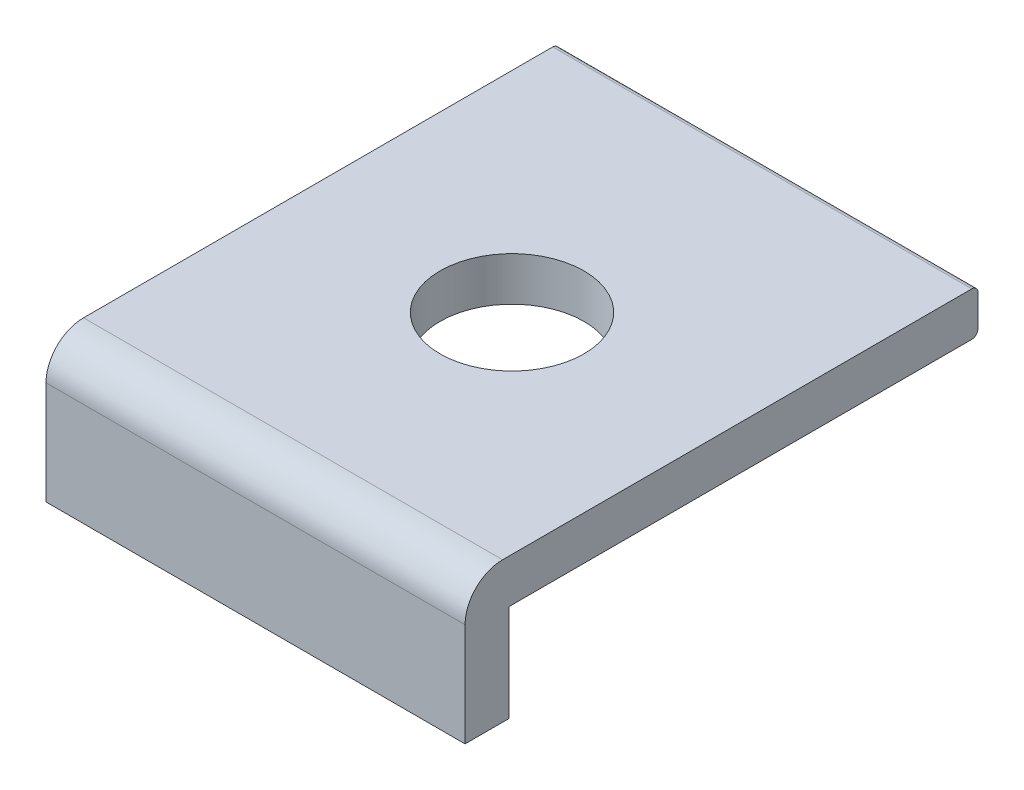
ISO-10303-21;
HEADER;
FILE_DESCRIPTION(('STEP AP214'),'2;1');
FILE_NAME('part.step','',(''),(''),'','','');
FILE_SCHEMA(('AUTOMOTIVE_DESIGN { 1 0 10303 214 1 1 1 1 }'));
ENDSEC;
DATA;
#1=APPLICATION_CONTEXT('core data for automotive mechanical design processes');
#2=APPLICATION_PROTOCOL_DEFINITION('international standard','automotive_design',2000,#1);
#3=PRODUCT_CONTEXT('',#1,'mechanical');
#4=PRODUCT('Part','Part','',(#3));
#5=PRODUCT_RELATED_PRODUCT_CATEGORY('part','',(#4));
#6=PRODUCT_DEFINITION_FORMATION('','',#4);
#7=PRODUCT_DEFINITION_CONTEXT('part definition',#1,'design');
#8=PRODUCT_DEFINITION('design','',#6,#7);
#9=PRODUCT_DEFINITION_SHAPE('','',#8);
#10=(LENGTH_UNIT() NAMED_UNIT(*) SI_UNIT(.MILLI.,.METRE.));
#11=(NAMED_UNIT(*) PLANE_ANGLE_UNIT() SI_UNIT($,.RADIAN.));
#12=(NAMED_UNIT(*) SI_UNIT($,.STERADIAN.) SOLID_ANGLE_UNIT());
#13=UNCERTAINTY_MEASURE_WITH_UNIT(LENGTH_MEASURE(1.E-05),#10,'distance_accuracy_value','');
#14=(GEOMETRIC_REPRESENTATION_CONTEXT(3) GLOBAL_UNCERTAINTY_ASSIGNED_CONTEXT((#13)) GLOBAL_UNIT_ASSIGNED_CONTEXT((#10,
#11,#12)) REPRESENTATION_CONTEXT('',''));
#15=CARTESIAN_POINT('',(0.,0.,0.));
#16=DIRECTION('',(0.,0.,1.));
#17=DIRECTION('',(1.,0.,0.));
#18=AXIS2_PLACEMENT_3D('',#15,#16,#17);
#19=CARTESIAN_POINT('',(6.7,0.,0.));
#20=DIRECTION('',(0.,1.,0.));
#21=DIRECTION('',(0.,0.,1.));
#22=AXIS2_PLACEMENT_3D('',#19,#20,#21);
#23=PLANE('',#22);
#24=DIRECTION('',(0.,0.,-1.));
#25=VECTOR('',#24,1.);
#26=CARTESIAN_POINT('',(0.,0.,0.));
#27=LINE('',#26,#25);
#28=CARTESIAN_POINT('',(0.,0.,0.));
#29=VERTEX_POINT('',#28);
#30=CARTESIAN_POINT('',(0.,0.,-0.7));
#31=VERTEX_POINT('',#30);
#32=EDGE_CURVE('E138',#29,#31,#27,.T.);
#33=ORIENTED_EDGE('',*,*,#32,.T.);
#34=DIRECTION('',(-1.,0.,0.));
#35=VECTOR('',#34,1.);
#36=CARTESIAN_POINT('',(6.7,0.,-0.7));
#37=LINE('',#36,#35);
#38=CARTESIAN_POINT('',(6.7,0.,-0.7));
#39=VERTEX_POINT('',#38);
#40=EDGE_CURVE('E11',#39,#31,#37,.T.);
#41=ORIENTED_EDGE('',*,*,#40,.F.);
#42=DIRECTION('',(0.,0.,-1.));
#43=VECTOR('',#42,1.);
#44=CARTESIAN_POINT('',(6.7,0.,0.));
#45=LINE('',#44,#43);
#46=CARTESIAN_POINT('',(6.7,0.,0.));
#47=VERTEX_POINT('',#46);
#48=EDGE_CURVE('E155',#47,#39,#45,.T.);
#49=ORIENTED_EDGE('',*,*,#48,.F.);
#50=DIRECTION('',(-1.,0.,0.));
#51=VECTOR('',#50,1.);
#52=CARTESIAN_POINT('',(6.7,0.,0.));
#53=LINE('',#52,#51);
#54=EDGE_CURVE('E134',#47,#29,#53,.T.);
#55=ORIENTED_EDGE('',*,*,#54,.T.);
#56=EDGE_LOOP('',(#33,#41,#49,#55));
#57=FACE_BOUND('',#56,.T.);
#58=ADVANCED_FACE('F36',(#57),#23,.F.);
#59=CARTESIAN_POINT('',(6.7,0.,-0.7));
#60=DIRECTION('',(0.,0.,1.));
#61=DIRECTION('',(1.,0.,0.));
#62=AXIS2_PLACEMENT_3D('',#59,#60,#61);
#63=PLANE('',#62);
#64=DIRECTION('',(0.,1.,0.));
#65=VECTOR('',#64,1.);
#66=CARTESIAN_POINT('',(0.,0.,-0.7));
#67=LINE('',#66,#65);
#68=CARTESIAN_POINT('',(0.,1.55,-0.7));
#69=VERTEX_POINT('',#68);
#70=EDGE_CURVE('E141',#31,#69,#67,.T.);
#71=ORIENTED_EDGE('',*,*,#70,.T.);
#72=DIRECTION('',(-1.,0.,0.));
#73=VECTOR('',#72,1.);
#74=CARTESIAN_POINT('',(6.7,1.55,-0.7));
#75=LINE('',#74,#73);
#76=CARTESIAN_POINT('',(6.7,1.55,-0.7));
#77=VERTEX_POINT('',#76);
#78=EDGE_CURVE('E44',#77,#69,#75,.T.);
#79=ORIENTED_EDGE('',*,*,#78,.F.);
#80=DIRECTION('',(0.,1.,0.));
#81=VECTOR('',#80,1.);
#82=CARTESIAN_POINT('',(6.7,0.,-0.7));
#83=LINE('',#82,#81);
#84=EDGE_CURVE('E98',#39,#77,#83,.T.);
#85=ORIENTED_EDGE('',*,*,#84,.F.);
#86=ORIENTED_EDGE('',*,*,#40,.T.);
#87=EDGE_LOOP('',(#71,#79,#85,#86));
#88=FACE_BOUND('',#87,.T.);
#89=ADVANCED_FACE('F217',(#88),#63,.F.);
#90=CARTESIAN_POINT('',(6.7,1.55,-0.7));
#91=DIRECTION('',(0.,1.,0.));
#92=DIRECTION('',(0.,0.,1.));
#93=AXIS2_PLACEMENT_3D('',#90,#91,#92);
#94=PLANE('',#93);
#95=CARTESIAN_POINT('',(3.35,1.55,-4.1005));
#96=DIRECTION('',(0.,1.,0.));
#97=DIRECTION('',(0.,0.,1.));
#98=AXIS2_PLACEMENT_3D('',#95,#96,#97);
#99=CIRCLE('',#98,1.15);
#100=CARTESIAN_POINT('',(3.35,1.55,-2.9505));
#101=VERTEX_POINT('',#100);
#102=EDGE_CURVE('E142',#101,#101,#99,.T.);
#103=ORIENTED_EDGE('',*,*,#102,.T.);
#104=EDGE_LOOP('',(#103));
#105=FACE_BOUND('',#104,.T.);
#106=DIRECTION('',(0.,0.,-1.));
#107=VECTOR('',#106,1.);
#108=CARTESIAN_POINT('',(0.,1.55,-0.7));
#109=LINE('',#108,#107);
#110=CARTESIAN_POINT('',(0.,1.55,-8.101));
#111=VERTEX_POINT('',#110);
#112=EDGE_CURVE('E144',#69,#111,#109,.T.);
#113=ORIENTED_EDGE('',*,*,#112,.T.);
#114=DIRECTION('',(-1.,0.,0.));
#115=VECTOR('',#114,1.);
#116=CARTESIAN_POINT('',(6.7,1.55,-8.101));
#117=LINE('',#116,#115);
#118=CARTESIAN_POINT('',(6.7,1.55,-8.101));
#119=VERTEX_POINT('',#118);
#120=EDGE_CURVE('E165',#119,#111,#117,.T.);
#121=ORIENTED_EDGE('',*,*,#120,.F.);
#122=DIRECTION('',(0.,0.,-1.));
#123=VECTOR('',#122,1.);
#124=CARTESIAN_POINT('',(6.7,1.55,-0.7));
#125=LINE('',#124,#123);
#126=EDGE_CURVE('E173',#77,#119,#125,.T.);
#127=ORIENTED_EDGE('',*,*,#126,.F.);
#128=ORIENTED_EDGE('',*,*,#78,.T.);
#129=EDGE_LOOP('',(#113,#121,#127,#128));
#130=FACE_BOUND('',#129,.T.);
#131=ADVANCED_FACE('F171',(#105,#130),#94,.F.);
#132=CARTESIAN_POINT('',(6.7,1.65,-8.101));
#133=DIRECTION('',(-1.,0.,0.));
#134=DIRECTION('',(0.,0.,1.));
#135=AXIS2_PLACEMENT_3D('',#132,#133,#134);
#136=CYLINDRICAL_SURFACE('',#135,0.0999999999999997);
#137=CARTESIAN_POINT('',(0.,1.65,-8.101));
#138=DIRECTION('',(1.,0.,0.));
#139=DIRECTION('',(0.,0.,1.));
#140=AXIS2_PLACEMENT_3D('',#137,#138,#139);
#141=CIRCLE('',#140,0.0999999999999997);
#142=CARTESIAN_POINT('',(0.,1.65,-8.201));
#143=VERTEX_POINT('',#142);
#144=EDGE_CURVE('E146',#111,#143,#141,.T.);
#145=ORIENTED_EDGE('',*,*,#144,.T.);
#146=DIRECTION('',(-1.,0.,0.));
#147=VECTOR('',#146,1.);
#148=CARTESIAN_POINT('',(6.7,1.65,-8.201));
#149=LINE('',#148,#147);
#150=CARTESIAN_POINT('',(6.7,1.65,-8.201));
#151=VERTEX_POINT('',#150);
#152=EDGE_CURVE('E162',#151,#143,#149,.T.);
#153=ORIENTED_EDGE('',*,*,#152,.F.);
#154=CARTESIAN_POINT('',(6.7,1.65,-8.101));
#155=DIRECTION('',(1.,0.,0.));
#156=DIRECTION('',(0.,0.,1.));
#157=AXIS2_PLACEMENT_3D('',#154,#155,#156);
#158=CIRCLE('',#157,0.0999999999999997);
#159=EDGE_CURVE('E189',#119,#151,#158,.T.);
#160=ORIENTED_EDGE('',*,*,#159,.F.);
#161=ORIENTED_EDGE('',*,*,#120,.T.);
#162=EDGE_LOOP('',(#145,#153,#160,#161));
#163=FACE_BOUND('',#162,.T.);
#164=ADVANCED_FACE('F182',(#163),#136,.T.);
#165=CARTESIAN_POINT('',(6.7,2.15,-8.201));
#166=DIRECTION('',(0.,0.,1.));
#167=DIRECTION('',(1.,0.,0.));
#168=AXIS2_PLACEMENT_3D('',#165,#166,#167);
#169=PLANE('',#168);
#170=DIRECTION('',(0.,1.,0.));
#171=VECTOR('',#170,1.);
#172=CARTESIAN_POINT('',(0.,2.15,-8.201));
#173=LINE('',#172,#171);
#174=CARTESIAN_POINT('',(0.,2.15,-8.201));
#175=VERTEX_POINT('',#174);
#176=EDGE_CURVE('E148',#143,#175,#173,.T.);
#177=ORIENTED_EDGE('',*,*,#176,.T.);
#178=DIRECTION('',(-1.,0.,0.));
#179=VECTOR('',#178,1.);
#180=CARTESIAN_POINT('',(6.7,2.15,-8.201));
#181=LINE('',#180,#179);
#182=CARTESIAN_POINT('',(6.7,2.15,-8.201));
#183=VERTEX_POINT('',#182);
#184=EDGE_CURVE('E159',#183,#175,#181,.T.);
#185=ORIENTED_EDGE('',*,*,#184,.F.);
#186=DIRECTION('',(0.,1.,0.));
#187=VECTOR('',#186,1.);
#188=CARTESIAN_POINT('',(6.7,2.15,-8.201));
#189=LINE('',#188,#187);
#190=EDGE_CURVE('E188',#151,#183,#189,.T.);
#191=ORIENTED_EDGE('',*,*,#190,.F.);
#192=ORIENTED_EDGE('',*,*,#152,.T.);
#193=EDGE_LOOP('',(#177,#185,#191,#192));
#194=FACE_BOUND('',#193,.T.);
#195=ADVANCED_FACE('F186',(#194),#169,.F.);
#196=CARTESIAN_POINT('',(6.7,2.15,-8.101));
#197=DIRECTION('',(-1.,0.,0.));
#198=DIRECTION('',(0.,0.,1.));
#199=AXIS2_PLACEMENT_3D('',#196,#197,#198);
#200=CYLINDRICAL_SURFACE('',#199,0.0999999999999996);
#201=CARTESIAN_POINT('',(0.,2.15,-8.101));
#202=DIRECTION('',(1.,0.,0.));
#203=DIRECTION('',(0.,0.,-1.));
#204=AXIS2_PLACEMENT_3D('',#201,#202,#203);
#205=CIRCLE('',#204,0.0999999999999996);
#206=CARTESIAN_POINT('',(0.,2.25,-8.101));
#207=VERTEX_POINT('',#206);
#208=EDGE_CURVE('E150',#175,#207,#205,.T.);
#209=ORIENTED_EDGE('',*,*,#208,.T.);
#210=DIRECTION('',(-1.,0.,0.));
#211=VECTOR('',#210,1.);
#212=CARTESIAN_POINT('',(6.7,2.25,-8.101));
#213=LINE('',#212,#211);
#214=CARTESIAN_POINT('',(6.7,2.25,-8.101));
#215=VERTEX_POINT('',#214);
#216=EDGE_CURVE('E129',#215,#207,#213,.T.);
#217=ORIENTED_EDGE('',*,*,#216,.F.);
#218=CARTESIAN_POINT('',(6.7,2.15,-8.101));
#219=DIRECTION('',(1.,0.,0.));
#220=DIRECTION('',(0.,0.,-1.));
#221=AXIS2_PLACEMENT_3D('',#218,#219,#220);
#222=CIRCLE('',#221,0.0999999999999996);
#223=EDGE_CURVE('E120',#183,#215,#222,.T.);
#224=ORIENTED_EDGE('',*,*,#223,.F.);
#225=ORIENTED_EDGE('',*,*,#184,.T.);
#226=EDGE_LOOP('',(#209,#217,#224,#225));
#227=FACE_BOUND('',#226,.T.);
#228=ADVANCED_FACE('F206',(#227),#200,.T.);
#229=CARTESIAN_POINT('',(6.7,2.25,-0.600000000000004));
#230=DIRECTION('',(0.,-1.,0.));
#231=DIRECTION('',(0.,0.,-1.));
#232=AXIS2_PLACEMENT_3D('',#229,#230,#231);
#233=PLANE('',#232);
#234=CARTESIAN_POINT('',(3.35,2.25,-4.1005));
#235=DIRECTION('',(0.,1.,0.));
#236=DIRECTION('',(0.,0.,1.));
#237=AXIS2_PLACEMENT_3D('',#234,#235,#236);
#238=CIRCLE('',#237,1.15);
#239=CARTESIAN_POINT('',(3.35,2.25,-2.9505));
#240=VERTEX_POINT('',#239);
#241=EDGE_CURVE('E198',#240,#240,#238,.T.);
#242=ORIENTED_EDGE('',*,*,#241,.F.);
#243=EDGE_LOOP('',(#242));
#244=FACE_BOUND('',#243,.T.);
#245=DIRECTION('',(0.,0.,1.));
#246=VECTOR('',#245,1.);
#247=CARTESIAN_POINT('',(0.,2.25,-0.600000000000004));
#248=LINE('',#247,#246);
#249=CARTESIAN_POINT('',(0.,2.25,-0.600000000000004));
#250=VERTEX_POINT('',#249);
#251=EDGE_CURVE('E128',#207,#250,#248,.T.);
#252=ORIENTED_EDGE('',*,*,#251,.T.);
#253=DIRECTION('',(-1.,0.,0.));
#254=VECTOR('',#253,1.);
#255=CARTESIAN_POINT('',(6.7,2.25,-0.600000000000004));
#256=LINE('',#255,#254);
#257=CARTESIAN_POINT('',(6.7,2.25,-0.600000000000004));
#258=VERTEX_POINT('',#257);
#259=EDGE_CURVE('E125',#258,#250,#256,.T.);
#260=ORIENTED_EDGE('',*,*,#259,.F.);
#261=DIRECTION('',(0.,0.,1.));
#262=VECTOR('',#261,1.);
#263=CARTESIAN_POINT('',(6.7,2.25,-0.600000000000004));
#264=LINE('',#263,#262);
#265=EDGE_CURVE('E114',#215,#258,#264,.T.);
#266=ORIENTED_EDGE('',*,*,#265,.F.);
#267=ORIENTED_EDGE('',*,*,#216,.T.);
#268=EDGE_LOOP('',(#252,#260,#266,#267));
#269=FACE_BOUND('',#268,.T.);
#270=ADVANCED_FACE('F126',(#244,#269),#233,.F.);
#271=CARTESIAN_POINT('',(6.7,1.65,-0.6));
#272=DIRECTION('',(-1.,0.,0.));
#273=DIRECTION('',(0.,0.,1.));
#274=AXIS2_PLACEMENT_3D('',#271,#272,#273);
#275=CYLINDRICAL_SURFACE('',#274,0.6);
#276=CARTESIAN_POINT('',(0.,1.65,-0.6));
#277=DIRECTION('',(1.,0.,0.));
#278=DIRECTION('',(0.,0.,1.));
#279=AXIS2_PLACEMENT_3D('',#276,#277,#278);
#280=CIRCLE('',#279,0.6);
#281=CARTESIAN_POINT('',(0.,1.65,0.));
#282=VERTEX_POINT('',#281);
#283=EDGE_CURVE('E84',#250,#282,#280,.T.);
#284=ORIENTED_EDGE('',*,*,#283,.T.);
#285=DIRECTION('',(-1.,0.,0.));
#286=VECTOR('',#285,1.);
#287=CARTESIAN_POINT('',(6.7,1.65,0.));
#288=LINE('',#287,#286);
#289=CARTESIAN_POINT('',(6.7,1.65,0.));
#290=VERTEX_POINT('',#289);
#291=EDGE_CURVE('E130',#290,#282,#288,.T.);
#292=ORIENTED_EDGE('',*,*,#291,.F.);
#293=CARTESIAN_POINT('',(6.7,1.65,-0.6));
#294=DIRECTION('',(1.,0.,0.));
#295=DIRECTION('',(0.,0.,1.));
#296=AXIS2_PLACEMENT_3D('',#293,#294,#295);
#297=CIRCLE('',#296,0.6);
#298=EDGE_CURVE('E118',#258,#290,#297,.T.);
#299=ORIENTED_EDGE('',*,*,#298,.F.);
#300=ORIENTED_EDGE('',*,*,#259,.T.);
#301=EDGE_LOOP('',(#284,#292,#299,#300));
#302=FACE_BOUND('',#301,.T.);
#303=ADVANCED_FACE('F132',(#302),#275,.T.);
#304=CARTESIAN_POINT('',(6.7,0.,0.));
#305=DIRECTION('',(0.,0.,-1.));
#306=DIRECTION('',(-1.,0.,0.));
#307=AXIS2_PLACEMENT_3D('',#304,#305,#306);
#308=PLANE('',#307);
#309=DIRECTION('',(0.,-1.,0.));
#310=VECTOR('',#309,1.);
#311=CARTESIAN_POINT('',(0.,0.,0.));
#312=LINE('',#311,#310);
#313=EDGE_CURVE('E90',#282,#29,#312,.T.);
#314=ORIENTED_EDGE('',*,*,#313,.T.);
#315=ORIENTED_EDGE('',*,*,#54,.F.);
#316=DIRECTION('',(0.,-1.,0.));
#317=VECTOR('',#316,1.);
#318=CARTESIAN_POINT('',(6.7,0.,0.));
#319=LINE('',#318,#317);
#320=EDGE_CURVE('E52',#290,#47,#319,.T.);
#321=ORIENTED_EDGE('',*,*,#320,.F.);
#322=ORIENTED_EDGE('',*,*,#291,.T.);
#323=EDGE_LOOP('',(#314,#315,#321,#322));
#324=FACE_BOUND('',#323,.T.);
#325=ADVANCED_FACE('F212',(#324),#308,.F.);
#326=CARTESIAN_POINT('',(6.7,1.65,-8.101));
#327=DIRECTION('',(-1.,0.,0.));
#328=DIRECTION('',(0.,0.,1.));
#329=AXIS2_PLACEMENT_3D('',#326,#327,#328);
#330=PLANE('',#329);
#331=ORIENTED_EDGE('',*,*,#48,.T.);
#332=ORIENTED_EDGE('',*,*,#84,.T.);
#333=ORIENTED_EDGE('',*,*,#126,.T.);
#334=ORIENTED_EDGE('',*,*,#159,.T.);
#335=ORIENTED_EDGE('',*,*,#190,.T.);
#336=ORIENTED_EDGE('',*,*,#223,.T.);
#337=ORIENTED_EDGE('',*,*,#265,.T.);
#338=ORIENTED_EDGE('',*,*,#298,.T.);
#339=ORIENTED_EDGE('',*,*,#320,.T.);
#340=EDGE_LOOP('',(#331,#332,#333,#334,#335,#336,#337,#338,#339));
#341=FACE_BOUND('',#340,.T.);
#342=ADVANCED_FACE('F116',(#341),#330,.F.);
#343=CARTESIAN_POINT('',(0.,1.65,-8.101));
#344=DIRECTION('',(-1.,0.,0.));
#345=DIRECTION('',(0.,0.,1.));
#346=AXIS2_PLACEMENT_3D('',#343,#344,#345);
#347=PLANE('',#346);
#348=ORIENTED_EDGE('',*,*,#32,.F.);
#349=ORIENTED_EDGE('',*,*,#313,.F.);
#350=ORIENTED_EDGE('',*,*,#283,.F.);
#351=ORIENTED_EDGE('',*,*,#251,.F.);
#352=ORIENTED_EDGE('',*,*,#208,.F.);
#353=ORIENTED_EDGE('',*,*,#176,.F.);
#354=ORIENTED_EDGE('',*,*,#144,.F.);
#355=ORIENTED_EDGE('',*,*,#112,.F.);
#356=ORIENTED_EDGE('',*,*,#70,.F.);
#357=EDGE_LOOP('',(#348,#349,#350,#351,#352,#353,#354,#355,#356));
#358=FACE_BOUND('',#357,.T.);
#359=ADVANCED_FACE('F177',(#358),#347,.T.);
#360=CARTESIAN_POINT('',(3.35,-4.45,-4.1005));
#361=DIRECTION('',(0.,1.,0.));
#362=DIRECTION('',(0.,0.,1.));
#363=AXIS2_PLACEMENT_3D('',#360,#361,#362);
#364=CYLINDRICAL_SURFACE('',#363,1.15);
#365=ORIENTED_EDGE('',*,*,#241,.T.);
#366=EDGE_LOOP('',(#365));
#367=FACE_BOUND('',#366,.T.);
#368=ORIENTED_EDGE('',*,*,#102,.F.);
#369=EDGE_LOOP('',(#368));
#370=FACE_BOUND('',#369,.T.);
#371=ADVANCED_FACE('F202',(#367,#370),#364,.F.);
#372=CLOSED_SHELL('',(#58,#89,#131,#164,#195,#228,#270,#303,#325,#342,#359,#371));
#373=MANIFOLD_SOLID_BREP('B2',#372);
#374=ADVANCED_BREP_SHAPE_REPRESENTATION('',(#18,#373),#14);
#375=SHAPE_DEFINITION_REPRESENTATION(#9,#374);
ENDSEC;
END-ISO-10303-21;
